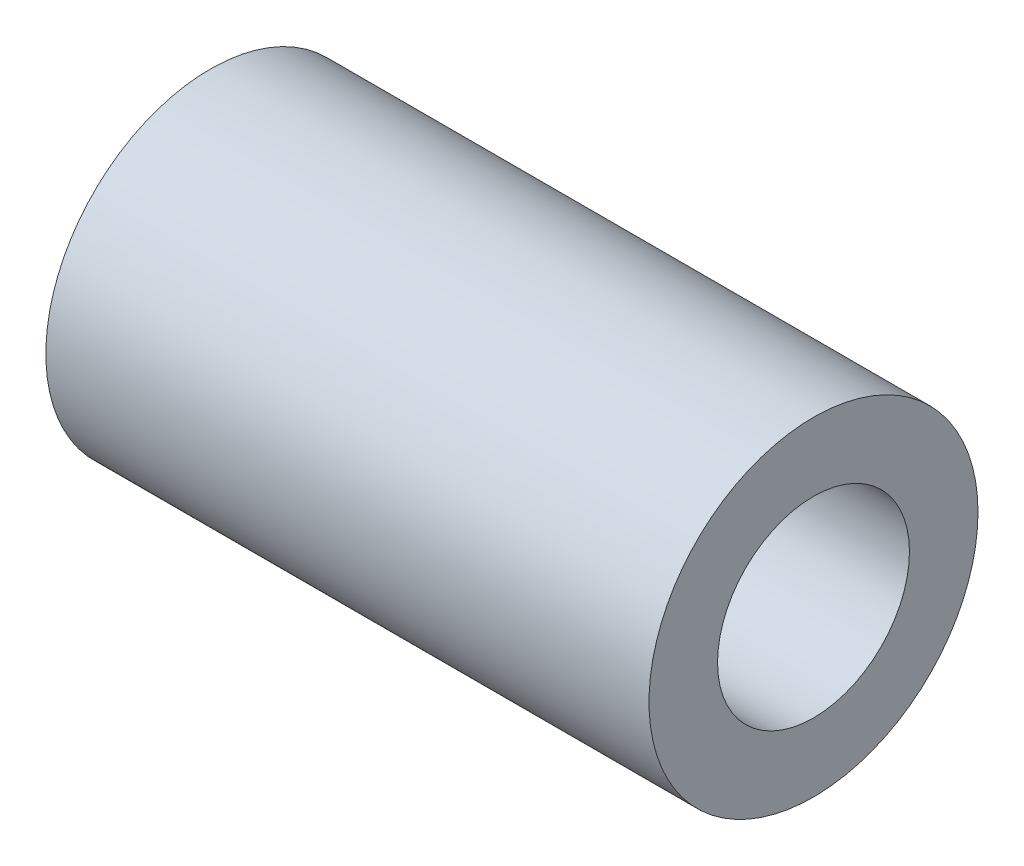
ISO-10303-21;
HEADER;
FILE_DESCRIPTION(('STEP AP214'),'2;1');
FILE_NAME('part.step','',(''),(''),'','','');
FILE_SCHEMA(('AUTOMOTIVE_DESIGN { 1 0 10303 214 1 1 1 1 }'));
ENDSEC;
DATA;
#1=APPLICATION_CONTEXT('core data for automotive mechanical design processes');
#2=APPLICATION_PROTOCOL_DEFINITION('international standard','automotive_design',2000,#1);
#3=PRODUCT_CONTEXT('',#1,'mechanical');
#4=PRODUCT('Part','Part','',(#3));
#5=PRODUCT_RELATED_PRODUCT_CATEGORY('part','',(#4));
#6=PRODUCT_DEFINITION_FORMATION('','',#4);
#7=PRODUCT_DEFINITION_CONTEXT('part definition',#1,'design');
#8=PRODUCT_DEFINITION('design','',#6,#7);
#9=PRODUCT_DEFINITION_SHAPE('','',#8);
#10=(LENGTH_UNIT() NAMED_UNIT(*) SI_UNIT(.MILLI.,.METRE.));
#11=(NAMED_UNIT(*) PLANE_ANGLE_UNIT() SI_UNIT($,.RADIAN.));
#12=(NAMED_UNIT(*) SI_UNIT($,.STERADIAN.) SOLID_ANGLE_UNIT());
#13=UNCERTAINTY_MEASURE_WITH_UNIT(LENGTH_MEASURE(1.E-05),#10,'distance_accuracy_value','');
#14=(GEOMETRIC_REPRESENTATION_CONTEXT(3) GLOBAL_UNCERTAINTY_ASSIGNED_CONTEXT((#13)) GLOBAL_UNIT_ASSIGNED_CONTEXT((#10,
#11,#12)) REPRESENTATION_CONTEXT('',''));
#15=CARTESIAN_POINT('',(0.,0.,0.));
#16=DIRECTION('',(0.,0.,1.));
#17=DIRECTION('',(1.,0.,0.));
#18=AXIS2_PLACEMENT_3D('',#15,#16,#17);
#19=CARTESIAN_POINT('',(5.5,0.,0.));
#20=DIRECTION('',(1.,0.,0.));
#21=DIRECTION('',(0.,0.,-1.));
#22=AXIS2_PLACEMENT_3D('',#19,#20,#21);
#23=PLANE('',#22);
#24=CARTESIAN_POINT('',(5.5,0.,0.));
#25=DIRECTION('',(1.,0.,0.));
#26=DIRECTION('',(0.,0.,-1.));
#27=AXIS2_PLACEMENT_3D('',#24,#25,#26);
#28=CIRCLE('',#27,3.);
#29=CARTESIAN_POINT('',(5.5,0.,-3.));
#30=VERTEX_POINT('',#29);
#31=EDGE_CURVE('E10',#30,#30,#28,.T.);
#32=ORIENTED_EDGE('',*,*,#31,.T.);
#33=EDGE_LOOP('',(#32));
#34=FACE_BOUND('',#33,.T.);
#35=CARTESIAN_POINT('',(5.5,0.,0.));
#36=DIRECTION('',(1.,0.,0.));
#37=DIRECTION('',(0.,0.,-1.));
#38=AXIS2_PLACEMENT_3D('',#35,#36,#37);
#39=CIRCLE('',#38,1.75);
#40=CARTESIAN_POINT('',(5.5,0.,-1.75));
#41=VERTEX_POINT('',#40);
#42=EDGE_CURVE('E48',#41,#41,#39,.T.);
#43=ORIENTED_EDGE('',*,*,#42,.F.);
#44=EDGE_LOOP('',(#43));
#45=FACE_BOUND('',#44,.T.);
#46=ADVANCED_FACE('F37',(#34,#45),#23,.T.);
#47=CARTESIAN_POINT('',(-5.5,0.,0.));
#48=DIRECTION('',(1.,0.,0.));
#49=DIRECTION('',(0.,0.,-1.));
#50=AXIS2_PLACEMENT_3D('',#47,#48,#49);
#51=PLANE('',#50);
#52=CARTESIAN_POINT('',(-5.5,0.,0.));
#53=DIRECTION('',(1.,0.,0.));
#54=DIRECTION('',(0.,0.,-1.));
#55=AXIS2_PLACEMENT_3D('',#52,#53,#54);
#56=CIRCLE('',#55,3.);
#57=CARTESIAN_POINT('',(-5.5,0.,-3.));
#58=VERTEX_POINT('',#57);
#59=EDGE_CURVE('E41',#58,#58,#56,.T.);
#60=ORIENTED_EDGE('',*,*,#59,.F.);
#61=EDGE_LOOP('',(#60));
#62=FACE_BOUND('',#61,.T.);
#63=CARTESIAN_POINT('',(-5.5,0.,0.));
#64=DIRECTION('',(1.,0.,0.));
#65=DIRECTION('',(0.,0.,-1.));
#66=AXIS2_PLACEMENT_3D('',#63,#64,#65);
#67=CIRCLE('',#66,1.75);
#68=CARTESIAN_POINT('',(-5.5,0.,-1.75));
#69=VERTEX_POINT('',#68);
#70=EDGE_CURVE('E50',#69,#69,#67,.T.);
#71=ORIENTED_EDGE('',*,*,#70,.T.);
#72=EDGE_LOOP('',(#71));
#73=FACE_BOUND('',#72,.T.);
#74=ADVANCED_FACE('F60',(#62,#73),#51,.F.);
#75=CARTESIAN_POINT('',(5.5,0.,0.));
#76=DIRECTION('',(-1.,0.,0.));
#77=DIRECTION('',(0.,0.,1.));
#78=AXIS2_PLACEMENT_3D('',#75,#76,#77);
#79=CYLINDRICAL_SURFACE('',#78,3.);
#80=ORIENTED_EDGE('',*,*,#31,.F.);
#81=EDGE_LOOP('',(#80));
#82=FACE_BOUND('',#81,.T.);
#83=ORIENTED_EDGE('',*,*,#59,.T.);
#84=EDGE_LOOP('',(#83));
#85=FACE_BOUND('',#84,.T.);
#86=ADVANCED_FACE('F39',(#82,#85),#79,.T.);
#87=CARTESIAN_POINT('',(5.5,0.,0.));
#88=DIRECTION('',(-1.,0.,0.));
#89=DIRECTION('',(0.,0.,1.));
#90=AXIS2_PLACEMENT_3D('',#87,#88,#89);
#91=CYLINDRICAL_SURFACE('',#90,1.75);
#92=ORIENTED_EDGE('',*,*,#42,.T.);
#93=EDGE_LOOP('',(#92));
#94=FACE_BOUND('',#93,.T.);
#95=ORIENTED_EDGE('',*,*,#70,.F.);
#96=EDGE_LOOP('',(#95));
#97=FACE_BOUND('',#96,.T.);
#98=ADVANCED_FACE('F56',(#94,#97),#91,.F.);
#99=CLOSED_SHELL('',(#46,#74,#86,#98));
#100=MANIFOLD_SOLID_BREP('B2',#99);
#101=ADVANCED_BREP_SHAPE_REPRESENTATION('',(#18,#100),#14);
#102=SHAPE_DEFINITION_REPRESENTATION(#9,#101);
ENDSEC;
END-ISO-10303-21;
